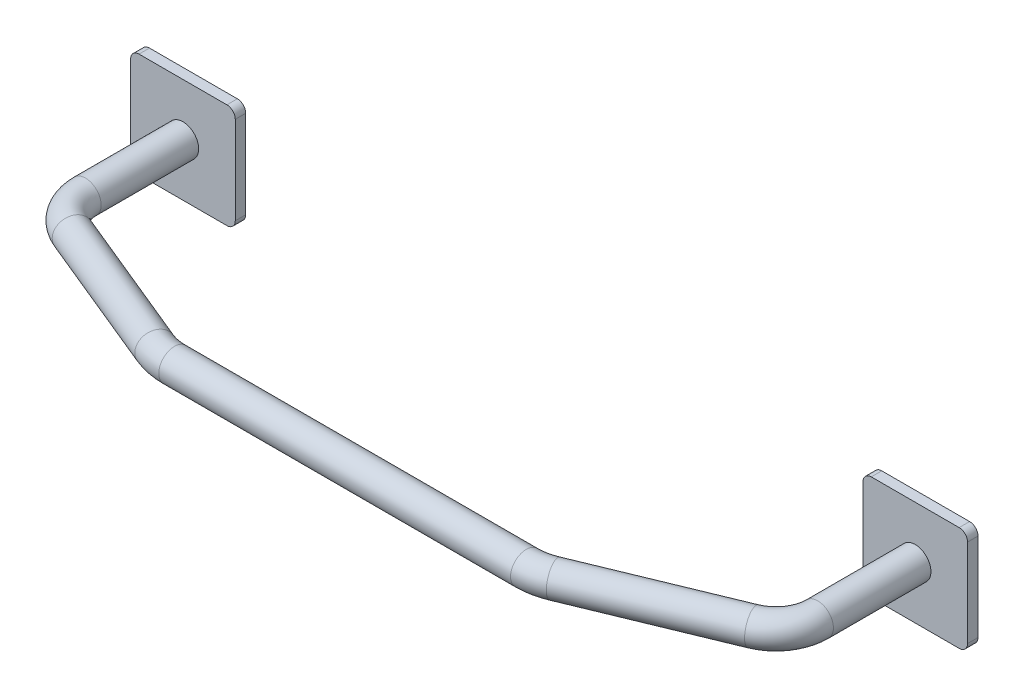
ISO-10303-21;
HEADER;
FILE_DESCRIPTION(('STEP AP214'),'2;1');
FILE_NAME('part.step','',(''),(''),'','','');
FILE_SCHEMA(('AUTOMOTIVE_DESIGN { 1 0 10303 214 1 1 1 1 }'));
ENDSEC;
DATA;
#1=APPLICATION_CONTEXT('core data for automotive mechanical design processes');
#2=APPLICATION_PROTOCOL_DEFINITION('international standard','automotive_design',2000,#1);
#3=PRODUCT_CONTEXT('',#1,'mechanical');
#4=PRODUCT('Part','Part','',(#3));
#5=PRODUCT_RELATED_PRODUCT_CATEGORY('part','',(#4));
#6=PRODUCT_DEFINITION_FORMATION('','',#4);
#7=PRODUCT_DEFINITION_CONTEXT('part definition',#1,'design');
#8=PRODUCT_DEFINITION('design','',#6,#7);
#9=PRODUCT_DEFINITION_SHAPE('','',#8);
#10=(LENGTH_UNIT() NAMED_UNIT(*) SI_UNIT(.MILLI.,.METRE.));
#11=(NAMED_UNIT(*) PLANE_ANGLE_UNIT() SI_UNIT($,.RADIAN.));
#12=(NAMED_UNIT(*) SI_UNIT($,.STERADIAN.) SOLID_ANGLE_UNIT());
#13=UNCERTAINTY_MEASURE_WITH_UNIT(LENGTH_MEASURE(1.E-05),#10,'distance_accuracy_value','');
#14=(GEOMETRIC_REPRESENTATION_CONTEXT(3) GLOBAL_UNCERTAINTY_ASSIGNED_CONTEXT((#13)) GLOBAL_UNIT_ASSIGNED_CONTEXT((#10,
#11,#12)) REPRESENTATION_CONTEXT('',''));
#15=CARTESIAN_POINT('',(0.,0.,0.));
#16=DIRECTION('',(0.,0.,1.));
#17=DIRECTION('',(1.,0.,0.));
#18=AXIS2_PLACEMENT_3D('',#15,#16,#17);
#19=CARTESIAN_POINT('',(-150.,25.,5.));
#20=DIRECTION('',(-1.,0.,0.));
#21=DIRECTION('',(0.,0.,1.));
#22=AXIS2_PLACEMENT_3D('',#19,#20,#21);
#23=PLANE('',#22);
#24=DIRECTION('',(0.,1.,0.));
#25=VECTOR('',#24,1.);
#26=CARTESIAN_POINT('',(-150.,25.,5.));
#27=LINE('',#26,#25);
#28=CARTESIAN_POINT('',(-150.,-21.,5.));
#29=VERTEX_POINT('',#28);
#30=CARTESIAN_POINT('',(-150.,21.,5.));
#31=VERTEX_POINT('',#30);
#32=EDGE_CURVE('E253',#29,#31,#27,.T.);
#33=ORIENTED_EDGE('',*,*,#32,.F.);
#34=DIRECTION('',(0.,0.,-1.));
#35=VECTOR('',#34,1.);
#36=CARTESIAN_POINT('',(-150.,-21.,5.));
#37=LINE('',#36,#35);
#38=CARTESIAN_POINT('',(-150.,-21.,0.));
#39=VERTEX_POINT('',#38);
#40=EDGE_CURVE('E279',#29,#39,#37,.T.);
#41=ORIENTED_EDGE('',*,*,#40,.T.);
#42=DIRECTION('',(0.,1.,0.));
#43=VECTOR('',#42,1.);
#44=CARTESIAN_POINT('',(-150.,25.,0.));
#45=LINE('',#44,#43);
#46=CARTESIAN_POINT('',(-150.,21.,0.));
#47=VERTEX_POINT('',#46);
#48=EDGE_CURVE('E251',#39,#47,#45,.T.);
#49=ORIENTED_EDGE('',*,*,#48,.T.);
#50=DIRECTION('',(0.,0.,-1.));
#51=VECTOR('',#50,1.);
#52=CARTESIAN_POINT('',(-150.,21.,5.));
#53=LINE('',#52,#51);
#54=EDGE_CURVE('E267',#47,#31,#53,.F.);
#55=ORIENTED_EDGE('',*,*,#54,.T.);
#56=EDGE_LOOP('',(#33,#41,#49,#55));
#57=FACE_BOUND('',#56,.T.);
#58=ADVANCED_FACE('F52',(#57),#23,.F.);
#59=CARTESIAN_POINT('',(-200.,25.,5.));
#60=DIRECTION('',(0.,-1.,0.));
#61=DIRECTION('',(0.,0.,-1.));
#62=AXIS2_PLACEMENT_3D('',#59,#60,#61);
#63=PLANE('',#62);
#64=DIRECTION('',(-1.,0.,0.));
#65=VECTOR('',#64,1.);
#66=CARTESIAN_POINT('',(-200.,25.,5.));
#67=LINE('',#66,#65);
#68=CARTESIAN_POINT('',(-154.,25.,5.));
#69=VERTEX_POINT('',#68);
#70=CARTESIAN_POINT('',(-196.,25.,5.));
#71=VERTEX_POINT('',#70);
#72=EDGE_CURVE('E257',#69,#71,#67,.T.);
#73=ORIENTED_EDGE('',*,*,#72,.F.);
#74=DIRECTION('',(0.,0.,-1.));
#75=VECTOR('',#74,1.);
#76=CARTESIAN_POINT('',(-154.,25.,5.));
#77=LINE('',#76,#75);
#78=CARTESIAN_POINT('',(-154.,25.,0.));
#79=VERTEX_POINT('',#78);
#80=EDGE_CURVE('E12',#69,#79,#77,.T.);
#81=ORIENTED_EDGE('',*,*,#80,.T.);
#82=DIRECTION('',(-1.,0.,0.));
#83=VECTOR('',#82,1.);
#84=CARTESIAN_POINT('',(-200.,25.,0.));
#85=LINE('',#84,#83);
#86=CARTESIAN_POINT('',(-196.,25.,0.));
#87=VERTEX_POINT('',#86);
#88=EDGE_CURVE('E269',#79,#87,#85,.T.);
#89=ORIENTED_EDGE('',*,*,#88,.T.);
#90=DIRECTION('',(0.,0.,-1.));
#91=VECTOR('',#90,1.);
#92=CARTESIAN_POINT('',(-196.,25.,5.));
#93=LINE('',#92,#91);
#94=EDGE_CURVE('E63',#87,#71,#93,.F.);
#95=ORIENTED_EDGE('',*,*,#94,.T.);
#96=EDGE_LOOP('',(#73,#81,#89,#95));
#97=FACE_BOUND('',#96,.T.);
#98=ADVANCED_FACE('F306',(#97),#63,.F.);
#99=CARTESIAN_POINT('',(-200.,25.,5.));
#100=DIRECTION('',(1.,0.,0.));
#101=DIRECTION('',(0.,0.,-1.));
#102=AXIS2_PLACEMENT_3D('',#99,#100,#101);
#103=PLANE('',#102);
#104=DIRECTION('',(0.,-1.,0.));
#105=VECTOR('',#104,1.);
#106=CARTESIAN_POINT('',(-200.,25.,0.));
#107=LINE('',#106,#105);
#108=CARTESIAN_POINT('',(-200.,21.,0.));
#109=VERTEX_POINT('',#108);
#110=CARTESIAN_POINT('',(-200.,-21.,0.));
#111=VERTEX_POINT('',#110);
#112=EDGE_CURVE('E275',#109,#111,#107,.T.);
#113=ORIENTED_EDGE('',*,*,#112,.T.);
#114=DIRECTION('',(0.,0.,-1.));
#115=VECTOR('',#114,1.);
#116=CARTESIAN_POINT('',(-200.,-21.,5.));
#117=LINE('',#116,#115);
#118=CARTESIAN_POINT('',(-200.,-21.,5.));
#119=VERTEX_POINT('',#118);
#120=EDGE_CURVE('E66',#111,#119,#117,.F.);
#121=ORIENTED_EDGE('',*,*,#120,.T.);
#122=DIRECTION('',(0.,-1.,0.));
#123=VECTOR('',#122,1.);
#124=CARTESIAN_POINT('',(-200.,25.,5.));
#125=LINE('',#124,#123);
#126=CARTESIAN_POINT('',(-200.,21.,5.));
#127=VERTEX_POINT('',#126);
#128=EDGE_CURVE('E263',#127,#119,#125,.T.);
#129=ORIENTED_EDGE('',*,*,#128,.F.);
#130=DIRECTION('',(0.,0.,-1.));
#131=VECTOR('',#130,1.);
#132=CARTESIAN_POINT('',(-200.,21.,5.));
#133=LINE('',#132,#131);
#134=EDGE_CURVE('E297',#127,#109,#133,.T.);
#135=ORIENTED_EDGE('',*,*,#134,.T.);
#136=EDGE_LOOP('',(#113,#121,#129,#135));
#137=FACE_BOUND('',#136,.T.);
#138=ADVANCED_FACE('F313',(#137),#103,.F.);
#139=CARTESIAN_POINT('',(-200.,-25.,5.));
#140=DIRECTION('',(0.,1.,0.));
#141=DIRECTION('',(0.,0.,1.));
#142=AXIS2_PLACEMENT_3D('',#139,#140,#141);
#143=PLANE('',#142);
#144=DIRECTION('',(1.,0.,0.));
#145=VECTOR('',#144,1.);
#146=CARTESIAN_POINT('',(-200.,-25.,0.));
#147=LINE('',#146,#145);
#148=CARTESIAN_POINT('',(-196.,-25.,0.));
#149=VERTEX_POINT('',#148);
#150=CARTESIAN_POINT('',(-154.,-25.,0.));
#151=VERTEX_POINT('',#150);
#152=EDGE_CURVE('E260',#149,#151,#147,.T.);
#153=ORIENTED_EDGE('',*,*,#152,.T.);
#154=DIRECTION('',(0.,0.,-1.));
#155=VECTOR('',#154,1.);
#156=CARTESIAN_POINT('',(-154.,-25.,5.));
#157=LINE('',#156,#155);
#158=CARTESIAN_POINT('',(-154.,-25.,5.));
#159=VERTEX_POINT('',#158);
#160=EDGE_CURVE('E293',#151,#159,#157,.F.);
#161=ORIENTED_EDGE('',*,*,#160,.T.);
#162=DIRECTION('',(1.,0.,0.));
#163=VECTOR('',#162,1.);
#164=CARTESIAN_POINT('',(-200.,-25.,5.));
#165=LINE('',#164,#163);
#166=CARTESIAN_POINT('',(-196.,-25.,5.));
#167=VERTEX_POINT('',#166);
#168=EDGE_CURVE('E261',#167,#159,#165,.T.);
#169=ORIENTED_EDGE('',*,*,#168,.F.);
#170=DIRECTION('',(0.,0.,-1.));
#171=VECTOR('',#170,1.);
#172=CARTESIAN_POINT('',(-196.,-25.,5.));
#173=LINE('',#172,#171);
#174=EDGE_CURVE('E288',#167,#149,#173,.T.);
#175=ORIENTED_EDGE('',*,*,#174,.T.);
#176=EDGE_LOOP('',(#153,#161,#169,#175));
#177=FACE_BOUND('',#176,.T.);
#178=ADVANCED_FACE('F321',(#177),#143,.F.);
#179=CARTESIAN_POINT('',(0.,0.,5.));
#180=DIRECTION('',(0.,0.,1.));
#181=DIRECTION('',(1.,0.,0.));
#182=AXIS2_PLACEMENT_3D('',#179,#180,#181);
#183=PLANE('',#182);
#184=CARTESIAN_POINT('',(-175.,0.,5.));
#185=DIRECTION('',(0.,0.,-1.));
#186=DIRECTION('',(-1.,0.,0.));
#187=AXIS2_PLACEMENT_3D('',#184,#185,#186);
#188=CIRCLE('',#187,7.50000000000001);
#189=CARTESIAN_POINT('',(-182.5,0.,5.));
#190=VERTEX_POINT('',#189);
#191=EDGE_CURVE('E237',#190,#190,#188,.T.);
#192=ORIENTED_EDGE('',*,*,#191,.T.);
#193=EDGE_LOOP('',(#192));
#194=FACE_BOUND('',#193,.T.);
#195=ORIENTED_EDGE('',*,*,#168,.T.);
#196=CARTESIAN_POINT('',(-154.,-21.,5.));
#197=DIRECTION('',(0.,0.,1.));
#198=DIRECTION('',(1.,0.,0.));
#199=AXIS2_PLACEMENT_3D('',#196,#197,#198);
#200=CIRCLE('',#199,4.);
#201=EDGE_CURVE('E296',#159,#29,#200,.T.);
#202=ORIENTED_EDGE('',*,*,#201,.T.);
#203=ORIENTED_EDGE('',*,*,#32,.T.);
#204=CARTESIAN_POINT('',(-154.,21.,5.));
#205=DIRECTION('',(0.,0.,1.));
#206=DIRECTION('',(1.,0.,0.));
#207=AXIS2_PLACEMENT_3D('',#204,#205,#206);
#208=CIRCLE('',#207,4.);
#209=EDGE_CURVE('E295',#31,#69,#208,.T.);
#210=ORIENTED_EDGE('',*,*,#209,.T.);
#211=ORIENTED_EDGE('',*,*,#72,.T.);
#212=CARTESIAN_POINT('',(-196.,21.,5.));
#213=DIRECTION('',(0.,0.,1.));
#214=DIRECTION('',(1.,0.,0.));
#215=AXIS2_PLACEMENT_3D('',#212,#213,#214);
#216=CIRCLE('',#215,4.);
#217=EDGE_CURVE('E71',#71,#127,#216,.T.);
#218=ORIENTED_EDGE('',*,*,#217,.T.);
#219=ORIENTED_EDGE('',*,*,#128,.T.);
#220=CARTESIAN_POINT('',(-196.,-21.,5.));
#221=DIRECTION('',(0.,0.,1.));
#222=DIRECTION('',(1.,0.,0.));
#223=AXIS2_PLACEMENT_3D('',#220,#221,#222);
#224=CIRCLE('',#223,4.);
#225=EDGE_CURVE('E298',#119,#167,#224,.T.);
#226=ORIENTED_EDGE('',*,*,#225,.T.);
#227=EDGE_LOOP('',(#195,#202,#203,#210,#211,#218,#219,#226));
#228=FACE_BOUND('',#227,.T.);
#229=ADVANCED_FACE('F309',(#194,#228),#183,.T.);
#230=CARTESIAN_POINT('',(0.,0.,0.));
#231=DIRECTION('',(0.,0.,1.));
#232=DIRECTION('',(1.,0.,0.));
#233=AXIS2_PLACEMENT_3D('',#230,#231,#232);
#234=PLANE('',#233);
#235=ORIENTED_EDGE('',*,*,#48,.F.);
#236=CARTESIAN_POINT('',(-154.,-21.,0.));
#237=DIRECTION('',(0.,0.,1.));
#238=DIRECTION('',(1.,0.,0.));
#239=AXIS2_PLACEMENT_3D('',#236,#237,#238);
#240=CIRCLE('',#239,4.);
#241=EDGE_CURVE('E287',#39,#151,#240,.F.);
#242=ORIENTED_EDGE('',*,*,#241,.T.);
#243=ORIENTED_EDGE('',*,*,#152,.F.);
#244=CARTESIAN_POINT('',(-196.,-21.,0.));
#245=DIRECTION('',(0.,0.,1.));
#246=DIRECTION('',(1.,0.,0.));
#247=AXIS2_PLACEMENT_3D('',#244,#245,#246);
#248=CIRCLE('',#247,4.);
#249=EDGE_CURVE('E282',#149,#111,#248,.F.);
#250=ORIENTED_EDGE('',*,*,#249,.T.);
#251=ORIENTED_EDGE('',*,*,#112,.F.);
#252=CARTESIAN_POINT('',(-196.,21.,0.));
#253=DIRECTION('',(0.,0.,1.));
#254=DIRECTION('',(1.,0.,0.));
#255=AXIS2_PLACEMENT_3D('',#252,#253,#254);
#256=CIRCLE('',#255,4.);
#257=EDGE_CURVE('E276',#109,#87,#256,.F.);
#258=ORIENTED_EDGE('',*,*,#257,.T.);
#259=ORIENTED_EDGE('',*,*,#88,.F.);
#260=CARTESIAN_POINT('',(-154.,21.,0.));
#261=DIRECTION('',(0.,0.,1.));
#262=DIRECTION('',(1.,0.,0.));
#263=AXIS2_PLACEMENT_3D('',#260,#261,#262);
#264=CIRCLE('',#263,4.);
#265=EDGE_CURVE('E285',#79,#47,#264,.F.);
#266=ORIENTED_EDGE('',*,*,#265,.T.);
#267=EDGE_LOOP('',(#235,#242,#243,#250,#251,#258,#259,#266));
#268=FACE_BOUND('',#267,.T.);
#269=ADVANCED_FACE('F320',(#268),#234,.F.);
#270=CARTESIAN_POINT('',(-175.,0.,5.));
#271=DIRECTION('',(0.,0.,1.));
#272=DIRECTION('',(1.,0.,0.));
#273=AXIS2_PLACEMENT_3D('',#270,#271,#272);
#274=CYLINDRICAL_SURFACE('',#273,7.50000000000001);
#275=CARTESIAN_POINT('',(-175.,0.,51.6061455166468));
#276=DIRECTION('',(0.,0.,-1.));
#277=DIRECTION('',(-1.,0.,0.));
#278=AXIS2_PLACEMENT_3D('',#275,#276,#277);
#279=CIRCLE('',#278,7.50000000000001);
#280=CARTESIAN_POINT('',(-182.5,0.,51.6061455166468));
#281=VERTEX_POINT('',#280);
#282=EDGE_CURVE('E245',#281,#281,#279,.T.);
#283=ORIENTED_EDGE('',*,*,#282,.T.);
#284=EDGE_LOOP('',(#283));
#285=FACE_BOUND('',#284,.T.);
#286=ORIENTED_EDGE('',*,*,#191,.F.);
#287=EDGE_LOOP('',(#286));
#288=FACE_BOUND('',#287,.T.);
#289=ADVANCED_FACE('F353',(#285,#288),#274,.T.);
#290=CARTESIAN_POINT('',(-155.,0.,51.6061455166468));
#291=DIRECTION('',(0.,1.,0.));
#292=DIRECTION('',(0.,0.,1.));
#293=AXIS2_PLACEMENT_3D('',#290,#291,#292);
#294=TOROIDAL_SURFACE('',#293,20.,7.50000000000001);
#295=CARTESIAN_POINT('',(-162.614996105086,0.,70.0997074861411));
#296=DIRECTION('',(-0.924678098474716,0.,-0.380749805254295));
#297=DIRECTION('',(-0.380749805254295,0.,0.924678098474716));
#298=AXIS2_PLACEMENT_3D('',#295,#296,#297);
#299=CIRCLE('',#298,7.50000000000001);
#300=CARTESIAN_POINT('',(-165.470619644493,0.,77.0347932247015));
#301=VERTEX_POINT('',#300);
#302=EDGE_CURVE('E244',#301,#301,#299,.T.);
#303=CARTESIAN_POINT('',(-155.,0.,51.6061455166468));
#304=DIRECTION('',(0.,1.,0.));
#305=DIRECTION('',(0.,0.,1.));
#306=AXIS2_PLACEMENT_3D('',#303,#304,#305);
#307=CIRCLE('',#306,27.5);
#308=EDGE_CURVE('',#281,#301,#307,.T.);
#309=ORIENTED_EDGE('',*,*,#282,.F.);
#310=ORIENTED_EDGE('',*,*,#302,.T.);
#311=ORIENTED_EDGE('',*,*,#308,.T.);
#312=ORIENTED_EDGE('',*,*,#308,.F.);
#313=EDGE_LOOP('',(#309,#311,#310,#312));
#314=FACE_BOUND('',#313,.T.);
#315=ADVANCED_FACE('F363',(#314),#294,.T.);
#316=CARTESIAN_POINT('',(-162.614996105086,0.,70.0997074861411));
#317=DIRECTION('',(0.924678098474716,0.,0.380749805254295));
#318=DIRECTION('',(0.380749805254295,0.,-0.924678098474716));
#319=AXIS2_PLACEMENT_3D('',#316,#317,#318);
#320=CYLINDRICAL_SURFACE('',#319,7.50000000000001);
#321=CARTESIAN_POINT('',(-95.4877385396994,0.,97.7403429542414));
#322=DIRECTION('',(-0.924678098474716,0.,-0.380749805254295));
#323=DIRECTION('',(-0.380749805254295,0.,0.924678098474716));
#324=AXIS2_PLACEMENT_3D('',#321,#322,#323);
#325=CIRCLE('',#324,7.50000000000001);
#326=CARTESIAN_POINT('',(-98.3433620791066,0.,104.675428692802));
#327=VERTEX_POINT('',#326);
#328=EDGE_CURVE('E247',#327,#327,#325,.T.);
#329=ORIENTED_EDGE('',*,*,#328,.T.);
#330=EDGE_LOOP('',(#329));
#331=FACE_BOUND('',#330,.T.);
#332=ORIENTED_EDGE('',*,*,#302,.F.);
#333=EDGE_LOOP('',(#332));
#334=FACE_BOUND('',#333,.T.);
#335=ADVANCED_FACE('F366',(#331,#334),#320,.T.);
#336=CARTESIAN_POINT('',(-84.0652443820704,0.,70.));
#337=DIRECTION('',(0.,1.,0.));
#338=DIRECTION('',(0.,0.,1.));
#339=AXIS2_PLACEMENT_3D('',#336,#337,#338);
#340=TOROIDAL_SURFACE('',#339,30.,7.50000000000001);
#341=CARTESIAN_POINT('',(-84.0652443820704,0.,100.));
#342=DIRECTION('',(-1.,0.,0.));
#343=DIRECTION('',(0.,0.,1.));
#344=AXIS2_PLACEMENT_3D('',#341,#342,#343);
#345=CIRCLE('',#344,7.50000000000001);
#346=CARTESIAN_POINT('',(-84.0652443820704,0.,107.5));
#347=VERTEX_POINT('',#346);
#348=EDGE_CURVE('E252',#347,#347,#345,.T.);
#349=CARTESIAN_POINT('',(-84.0652443820704,0.,70.));
#350=DIRECTION('',(0.,1.,0.));
#351=DIRECTION('',(0.,0.,1.));
#352=AXIS2_PLACEMENT_3D('',#349,#350,#351);
#353=CIRCLE('',#352,37.5);
#354=EDGE_CURVE('',#327,#347,#353,.T.);
#355=ORIENTED_EDGE('',*,*,#328,.F.);
#356=ORIENTED_EDGE('',*,*,#348,.T.);
#357=ORIENTED_EDGE('',*,*,#354,.T.);
#358=ORIENTED_EDGE('',*,*,#354,.F.);
#359=EDGE_LOOP('',(#355,#357,#356,#358));
#360=FACE_BOUND('',#359,.T.);
#361=ADVANCED_FACE('F357',(#360),#340,.T.);
#362=CARTESIAN_POINT('',(-84.0652443820704,0.,100.));
#363=DIRECTION('',(1.,0.,0.));
#364=DIRECTION('',(0.,0.,-1.));
#365=AXIS2_PLACEMENT_3D('',#362,#363,#364);
#366=CYLINDRICAL_SURFACE('',#365,7.50000000000001);
#367=ORIENTED_EDGE('',*,*,#348,.F.);
#368=EDGE_LOOP('',(#367));
#369=FACE_BOUND('',#368,.T.);
#370=CARTESIAN_POINT('',(84.0652443820704,0.,100.));
#371=DIRECTION('',(-1.,0.,0.));
#372=DIRECTION('',(0.,0.,1.));
#373=AXIS2_PLACEMENT_3D('',#370,#371,#372);
#374=CIRCLE('',#373,7.50000000000001);
#375=CARTESIAN_POINT('',(84.0652443820704,0.,107.5));
#376=VERTEX_POINT('',#375);
#377=EDGE_CURVE('E191',#376,#376,#374,.T.);
#378=ORIENTED_EDGE('',*,*,#377,.T.);
#379=EDGE_LOOP('',(#378));
#380=FACE_BOUND('',#379,.T.);
#381=ADVANCED_FACE('F355',(#369,#380),#366,.T.);
#382=CARTESIAN_POINT('',(-154.,-21.,5.));
#383=DIRECTION('',(0.,0.,-1.));
#384=DIRECTION('',(-1.,0.,0.));
#385=AXIS2_PLACEMENT_3D('',#382,#383,#384);
#386=CYLINDRICAL_SURFACE('',#385,4.);
#387=ORIENTED_EDGE('',*,*,#201,.F.);
#388=ORIENTED_EDGE('',*,*,#160,.F.);
#389=ORIENTED_EDGE('',*,*,#241,.F.);
#390=ORIENTED_EDGE('',*,*,#40,.F.);
#391=EDGE_LOOP('',(#387,#388,#389,#390));
#392=FACE_BOUND('',#391,.T.);
#393=ADVANCED_FACE('F332',(#392),#386,.T.);
#394=CARTESIAN_POINT('',(-196.,-21.,5.));
#395=DIRECTION('',(0.,0.,-1.));
#396=DIRECTION('',(-1.,0.,0.));
#397=AXIS2_PLACEMENT_3D('',#394,#395,#396);
#398=CYLINDRICAL_SURFACE('',#397,4.);
#399=ORIENTED_EDGE('',*,*,#225,.F.);
#400=ORIENTED_EDGE('',*,*,#120,.F.);
#401=ORIENTED_EDGE('',*,*,#249,.F.);
#402=ORIENTED_EDGE('',*,*,#174,.F.);
#403=EDGE_LOOP('',(#399,#400,#401,#402));
#404=FACE_BOUND('',#403,.T.);
#405=ADVANCED_FACE('F324',(#404),#398,.T.);
#406=CARTESIAN_POINT('',(-154.,21.,5.));
#407=DIRECTION('',(0.,0.,-1.));
#408=DIRECTION('',(-1.,0.,0.));
#409=AXIS2_PLACEMENT_3D('',#406,#407,#408);
#410=CYLINDRICAL_SURFACE('',#409,4.);
#411=ORIENTED_EDGE('',*,*,#209,.F.);
#412=ORIENTED_EDGE('',*,*,#54,.F.);
#413=ORIENTED_EDGE('',*,*,#265,.F.);
#414=ORIENTED_EDGE('',*,*,#80,.F.);
#415=EDGE_LOOP('',(#411,#412,#413,#414));
#416=FACE_BOUND('',#415,.T.);
#417=ADVANCED_FACE('F331',(#416),#410,.T.);
#418=CARTESIAN_POINT('',(-196.,21.,5.));
#419=DIRECTION('',(0.,0.,-1.));
#420=DIRECTION('',(-1.,0.,0.));
#421=AXIS2_PLACEMENT_3D('',#418,#419,#420);
#422=CYLINDRICAL_SURFACE('',#421,4.);
#423=ORIENTED_EDGE('',*,*,#217,.F.);
#424=ORIENTED_EDGE('',*,*,#94,.F.);
#425=ORIENTED_EDGE('',*,*,#257,.F.);
#426=ORIENTED_EDGE('',*,*,#134,.F.);
#427=EDGE_LOOP('',(#423,#424,#425,#426));
#428=FACE_BOUND('',#427,.T.);
#429=ADVANCED_FACE('F54',(#428),#422,.T.);
#430=CARTESIAN_POINT('',(150.,25.,5.));
#431=DIRECTION('',(1.,0.,0.));
#432=DIRECTION('',(0.,0.,1.));
#433=AXIS2_PLACEMENT_3D('',#430,#431,#432);
#434=PLANE('',#433);
#435=DIRECTION('',(0.,1.,0.));
#436=VECTOR('',#435,1.);
#437=CARTESIAN_POINT('',(150.,25.,5.));
#438=LINE('',#437,#436);
#439=CARTESIAN_POINT('',(150.,-21.,5.));
#440=VERTEX_POINT('',#439);
#441=CARTESIAN_POINT('',(150.,21.,5.));
#442=VERTEX_POINT('',#441);
#443=EDGE_CURVE('E208',#440,#442,#438,.T.);
#444=ORIENTED_EDGE('',*,*,#443,.T.);
#445=DIRECTION('',(0.,0.,-1.));
#446=VECTOR('',#445,1.);
#447=CARTESIAN_POINT('',(150.,21.,5.));
#448=LINE('',#447,#446);
#449=CARTESIAN_POINT('',(150.,21.,0.));
#450=VERTEX_POINT('',#449);
#451=EDGE_CURVE('E188',#450,#442,#448,.F.);
#452=ORIENTED_EDGE('',*,*,#451,.F.);
#453=DIRECTION('',(0.,1.,0.));
#454=VECTOR('',#453,1.);
#455=CARTESIAN_POINT('',(150.,25.,0.));
#456=LINE('',#455,#454);
#457=CARTESIAN_POINT('',(150.,-21.,0.));
#458=VERTEX_POINT('',#457);
#459=EDGE_CURVE('E175',#458,#450,#456,.T.);
#460=ORIENTED_EDGE('',*,*,#459,.F.);
#461=DIRECTION('',(0.,0.,-1.));
#462=VECTOR('',#461,1.);
#463=CARTESIAN_POINT('',(150.,-21.,5.));
#464=LINE('',#463,#462);
#465=EDGE_CURVE('E182',#440,#458,#464,.T.);
#466=ORIENTED_EDGE('',*,*,#465,.F.);
#467=EDGE_LOOP('',(#444,#452,#460,#466));
#468=FACE_BOUND('',#467,.T.);
#469=ADVANCED_FACE('F194',(#468),#434,.F.);
#470=CARTESIAN_POINT('',(200.,25.,5.));
#471=DIRECTION('',(0.,-1.,0.));
#472=DIRECTION('',(0.,0.,-1.));
#473=AXIS2_PLACEMENT_3D('',#470,#471,#472);
#474=PLANE('',#473);
#475=DIRECTION('',(1.,0.,0.));
#476=VECTOR('',#475,1.);
#477=CARTESIAN_POINT('',(200.,25.,5.));
#478=LINE('',#477,#476);
#479=CARTESIAN_POINT('',(154.,25.,5.));
#480=VERTEX_POINT('',#479);
#481=CARTESIAN_POINT('',(196.,25.,5.));
#482=VERTEX_POINT('',#481);
#483=EDGE_CURVE('E614',#480,#482,#478,.T.);
#484=ORIENTED_EDGE('',*,*,#483,.T.);
#485=DIRECTION('',(0.,0.,-1.));
#486=VECTOR('',#485,1.);
#487=CARTESIAN_POINT('',(196.,25.,5.));
#488=LINE('',#487,#486);
#489=CARTESIAN_POINT('',(196.,25.,0.));
#490=VERTEX_POINT('',#489);
#491=EDGE_CURVE('E231',#490,#482,#488,.F.);
#492=ORIENTED_EDGE('',*,*,#491,.F.);
#493=DIRECTION('',(1.,0.,0.));
#494=VECTOR('',#493,1.);
#495=CARTESIAN_POINT('',(200.,25.,0.));
#496=LINE('',#495,#494);
#497=CARTESIAN_POINT('',(154.,25.,0.));
#498=VERTEX_POINT('',#497);
#499=EDGE_CURVE('E195',#498,#490,#496,.T.);
#500=ORIENTED_EDGE('',*,*,#499,.F.);
#501=DIRECTION('',(0.,0.,-1.));
#502=VECTOR('',#501,1.);
#503=CARTESIAN_POINT('',(154.,25.,5.));
#504=LINE('',#503,#502);
#505=EDGE_CURVE('E236',#480,#498,#504,.T.);
#506=ORIENTED_EDGE('',*,*,#505,.F.);
#507=EDGE_LOOP('',(#484,#492,#500,#506));
#508=FACE_BOUND('',#507,.T.);
#509=ADVANCED_FACE('F420',(#508),#474,.F.);
#510=CARTESIAN_POINT('',(200.,25.,5.));
#511=DIRECTION('',(-1.,0.,0.));
#512=DIRECTION('',(0.,0.,-1.));
#513=AXIS2_PLACEMENT_3D('',#510,#511,#512);
#514=PLANE('',#513);
#515=DIRECTION('',(0.,-1.,0.));
#516=VECTOR('',#515,1.);
#517=CARTESIAN_POINT('',(200.,25.,0.));
#518=LINE('',#517,#516);
#519=CARTESIAN_POINT('',(200.,21.,0.));
#520=VERTEX_POINT('',#519);
#521=CARTESIAN_POINT('',(200.,-21.,0.));
#522=VERTEX_POINT('',#521);
#523=EDGE_CURVE('E196',#520,#522,#518,.T.);
#524=ORIENTED_EDGE('',*,*,#523,.F.);
#525=DIRECTION('',(0.,0.,-1.));
#526=VECTOR('',#525,1.);
#527=CARTESIAN_POINT('',(200.,21.,5.));
#528=LINE('',#527,#526);
#529=CARTESIAN_POINT('',(200.,21.,5.));
#530=VERTEX_POINT('',#529);
#531=EDGE_CURVE('E227',#530,#520,#528,.T.);
#532=ORIENTED_EDGE('',*,*,#531,.F.);
#533=DIRECTION('',(0.,-1.,0.));
#534=VECTOR('',#533,1.);
#535=CARTESIAN_POINT('',(200.,25.,5.));
#536=LINE('',#535,#534);
#537=CARTESIAN_POINT('',(200.,-21.,5.));
#538=VERTEX_POINT('',#537);
#539=EDGE_CURVE('E612',#530,#538,#536,.T.);
#540=ORIENTED_EDGE('',*,*,#539,.T.);
#541=DIRECTION('',(0.,0.,-1.));
#542=VECTOR('',#541,1.);
#543=CARTESIAN_POINT('',(200.,-21.,5.));
#544=LINE('',#543,#542);
#545=EDGE_CURVE('E229',#522,#538,#544,.F.);
#546=ORIENTED_EDGE('',*,*,#545,.F.);
#547=EDGE_LOOP('',(#524,#532,#540,#546));
#548=FACE_BOUND('',#547,.T.);
#549=ADVANCED_FACE('F424',(#548),#514,.F.);
#550=CARTESIAN_POINT('',(200.,-25.,5.));
#551=DIRECTION('',(0.,1.,0.));
#552=DIRECTION('',(0.,0.,1.));
#553=AXIS2_PLACEMENT_3D('',#550,#551,#552);
#554=PLANE('',#553);
#555=DIRECTION('',(-1.,0.,0.));
#556=VECTOR('',#555,1.);
#557=CARTESIAN_POINT('',(200.,-25.,0.));
#558=LINE('',#557,#556);
#559=CARTESIAN_POINT('',(196.,-25.,0.));
#560=VERTEX_POINT('',#559);
#561=CARTESIAN_POINT('',(154.,-25.,0.));
#562=VERTEX_POINT('',#561);
#563=EDGE_CURVE('E174',#560,#562,#558,.T.);
#564=ORIENTED_EDGE('',*,*,#563,.F.);
#565=DIRECTION('',(0.,0.,-1.));
#566=VECTOR('',#565,1.);
#567=CARTESIAN_POINT('',(196.,-25.,5.));
#568=LINE('',#567,#566);
#569=CARTESIAN_POINT('',(196.,-25.,5.));
#570=VERTEX_POINT('',#569);
#571=EDGE_CURVE('E177',#570,#560,#568,.T.);
#572=ORIENTED_EDGE('',*,*,#571,.F.);
#573=DIRECTION('',(-1.,0.,0.));
#574=VECTOR('',#573,1.);
#575=CARTESIAN_POINT('',(200.,-25.,5.));
#576=LINE('',#575,#574);
#577=CARTESIAN_POINT('',(154.,-25.,5.));
#578=VERTEX_POINT('',#577);
#579=EDGE_CURVE('E204',#570,#578,#576,.T.);
#580=ORIENTED_EDGE('',*,*,#579,.T.);
#581=DIRECTION('',(0.,0.,-1.));
#582=VECTOR('',#581,1.);
#583=CARTESIAN_POINT('',(154.,-25.,5.));
#584=LINE('',#583,#582);
#585=EDGE_CURVE('E216',#562,#578,#584,.F.);
#586=ORIENTED_EDGE('',*,*,#585,.F.);
#587=EDGE_LOOP('',(#564,#572,#580,#586));
#588=FACE_BOUND('',#587,.T.);
#589=ADVANCED_FACE('F432',(#588),#554,.F.);
#590=CARTESIAN_POINT('',(0.,0.,5.));
#591=DIRECTION('',(0.,0.,1.));
#592=DIRECTION('',(-1.,0.,0.));
#593=AXIS2_PLACEMENT_3D('',#590,#591,#592);
#594=PLANE('',#593);
#595=CARTESIAN_POINT('',(175.,0.,5.));
#596=DIRECTION('',(0.,0.,1.));
#597=DIRECTION('',(1.,0.,0.));
#598=AXIS2_PLACEMENT_3D('',#595,#596,#597);
#599=CIRCLE('',#598,7.50000000000001);
#600=CARTESIAN_POINT('',(182.5,0.,5.));
#601=VERTEX_POINT('',#600);
#602=EDGE_CURVE('E628',#601,#601,#599,.T.);
#603=ORIENTED_EDGE('',*,*,#602,.F.);
#604=EDGE_LOOP('',(#603));
#605=FACE_BOUND('',#604,.T.);
#606=ORIENTED_EDGE('',*,*,#579,.F.);
#607=CARTESIAN_POINT('',(196.,-21.,5.));
#608=DIRECTION('',(0.,0.,-1.));
#609=DIRECTION('',(-1.,0.,0.));
#610=AXIS2_PLACEMENT_3D('',#607,#608,#609);
#611=CIRCLE('',#610,4.);
#612=EDGE_CURVE('E224',#538,#570,#611,.T.);
#613=ORIENTED_EDGE('',*,*,#612,.F.);
#614=ORIENTED_EDGE('',*,*,#539,.F.);
#615=CARTESIAN_POINT('',(196.,21.,5.));
#616=DIRECTION('',(0.,0.,-1.));
#617=DIRECTION('',(-1.,0.,0.));
#618=AXIS2_PLACEMENT_3D('',#615,#616,#617);
#619=CIRCLE('',#618,4.);
#620=EDGE_CURVE('E219',#482,#530,#619,.T.);
#621=ORIENTED_EDGE('',*,*,#620,.F.);
#622=ORIENTED_EDGE('',*,*,#483,.F.);
#623=CARTESIAN_POINT('',(154.,21.,5.));
#624=DIRECTION('',(0.,0.,-1.));
#625=DIRECTION('',(-1.,0.,0.));
#626=AXIS2_PLACEMENT_3D('',#623,#624,#625);
#627=CIRCLE('',#626,4.);
#628=EDGE_CURVE('E225',#442,#480,#627,.T.);
#629=ORIENTED_EDGE('',*,*,#628,.F.);
#630=ORIENTED_EDGE('',*,*,#443,.F.);
#631=CARTESIAN_POINT('',(154.,-21.,5.));
#632=DIRECTION('',(0.,0.,-1.));
#633=DIRECTION('',(-1.,0.,0.));
#634=AXIS2_PLACEMENT_3D('',#631,#632,#633);
#635=CIRCLE('',#634,4.);
#636=EDGE_CURVE('E184',#578,#440,#635,.T.);
#637=ORIENTED_EDGE('',*,*,#636,.F.);
#638=EDGE_LOOP('',(#606,#613,#614,#621,#622,#629,#630,#637));
#639=FACE_BOUND('',#638,.T.);
#640=ADVANCED_FACE('F442',(#605,#639),#594,.T.);
#641=CARTESIAN_POINT('',(0.,0.,0.));
#642=DIRECTION('',(0.,0.,1.));
#643=DIRECTION('',(-1.,0.,0.));
#644=AXIS2_PLACEMENT_3D('',#641,#642,#643);
#645=PLANE('',#644);
#646=ORIENTED_EDGE('',*,*,#459,.T.);
#647=CARTESIAN_POINT('',(154.,21.,0.));
#648=DIRECTION('',(0.,0.,-1.));
#649=DIRECTION('',(-1.,0.,0.));
#650=AXIS2_PLACEMENT_3D('',#647,#648,#649);
#651=CIRCLE('',#650,4.);
#652=EDGE_CURVE('E212',#498,#450,#651,.F.);
#653=ORIENTED_EDGE('',*,*,#652,.F.);
#654=ORIENTED_EDGE('',*,*,#499,.T.);
#655=CARTESIAN_POINT('',(196.,21.,0.));
#656=DIRECTION('',(0.,0.,-1.));
#657=DIRECTION('',(-1.,0.,0.));
#658=AXIS2_PLACEMENT_3D('',#655,#656,#657);
#659=CIRCLE('',#658,4.);
#660=EDGE_CURVE('E186',#520,#490,#659,.F.);
#661=ORIENTED_EDGE('',*,*,#660,.F.);
#662=ORIENTED_EDGE('',*,*,#523,.T.);
#663=CARTESIAN_POINT('',(196.,-21.,0.));
#664=DIRECTION('',(0.,0.,-1.));
#665=DIRECTION('',(-1.,0.,0.));
#666=AXIS2_PLACEMENT_3D('',#663,#664,#665);
#667=CIRCLE('',#666,4.);
#668=EDGE_CURVE('E179',#560,#522,#667,.F.);
#669=ORIENTED_EDGE('',*,*,#668,.F.);
#670=ORIENTED_EDGE('',*,*,#563,.T.);
#671=CARTESIAN_POINT('',(154.,-21.,0.));
#672=DIRECTION('',(0.,0.,-1.));
#673=DIRECTION('',(-1.,0.,0.));
#674=AXIS2_PLACEMENT_3D('',#671,#672,#673);
#675=CIRCLE('',#674,4.);
#676=EDGE_CURVE('E166',#458,#562,#675,.F.);
#677=ORIENTED_EDGE('',*,*,#676,.F.);
#678=EDGE_LOOP('',(#646,#653,#654,#661,#662,#669,#670,#677));
#679=FACE_BOUND('',#678,.T.);
#680=ADVANCED_FACE('F167',(#679),#645,.F.);
#681=CARTESIAN_POINT('',(175.,0.,5.));
#682=DIRECTION('',(0.,0.,1.));
#683=DIRECTION('',(-1.,0.,0.));
#684=AXIS2_PLACEMENT_3D('',#681,#682,#683);
#685=CYLINDRICAL_SURFACE('',#684,7.50000000000001);
#686=CARTESIAN_POINT('',(175.,0.,51.6061455166468));
#687=DIRECTION('',(0.,0.,1.));
#688=DIRECTION('',(1.,0.,0.));
#689=AXIS2_PLACEMENT_3D('',#686,#687,#688);
#690=CIRCLE('',#689,7.50000000000001);
#691=CARTESIAN_POINT('',(182.5,0.,51.6061455166468));
#692=VERTEX_POINT('',#691);
#693=EDGE_CURVE('E622',#692,#692,#690,.T.);
#694=ORIENTED_EDGE('',*,*,#693,.F.);
#695=EDGE_LOOP('',(#694));
#696=FACE_BOUND('',#695,.T.);
#697=ORIENTED_EDGE('',*,*,#602,.T.);
#698=EDGE_LOOP('',(#697));
#699=FACE_BOUND('',#698,.T.);
#700=ADVANCED_FACE('F459',(#696,#699),#685,.T.);
#701=CARTESIAN_POINT('',(155.,0.,51.6061455166468));
#702=DIRECTION('',(0.,1.,0.));
#703=DIRECTION('',(0.,0.,1.));
#704=AXIS2_PLACEMENT_3D('',#701,#702,#703);
#705=TOROIDAL_SURFACE('',#704,20.,7.50000000000001);
#706=CARTESIAN_POINT('',(162.614996105086,0.,70.0997074861411));
#707=DIRECTION('',(-0.924678098474716,0.,0.380749805254295));
#708=DIRECTION('',(0.380749805254295,0.,0.924678098474716));
#709=AXIS2_PLACEMENT_3D('',#706,#707,#708);
#710=CIRCLE('',#709,7.50000000000001);
#711=CARTESIAN_POINT('',(165.470619644493,0.,77.0347932247015));
#712=VERTEX_POINT('',#711);
#713=EDGE_CURVE('E625',#712,#712,#710,.T.);
#714=CARTESIAN_POINT('',(155.,0.,51.6061455166468));
#715=DIRECTION('',(0.,1.,0.));
#716=DIRECTION('',(0.,0.,1.));
#717=AXIS2_PLACEMENT_3D('',#714,#715,#716);
#718=CIRCLE('',#717,27.5);
#719=EDGE_CURVE('',#712,#692,#718,.T.);
#720=ORIENTED_EDGE('',*,*,#713,.F.);
#721=ORIENTED_EDGE('',*,*,#693,.T.);
#722=ORIENTED_EDGE('',*,*,#719,.T.);
#723=ORIENTED_EDGE('',*,*,#719,.F.);
#724=EDGE_LOOP('',(#720,#722,#721,#723));
#725=FACE_BOUND('',#724,.T.);
#726=ADVANCED_FACE('F466',(#725),#705,.T.);
#727=CARTESIAN_POINT('',(162.614996105086,0.,70.0997074861411));
#728=DIRECTION('',(-0.924678098474716,0.,0.380749805254295));
#729=DIRECTION('',(-0.380749805254295,0.,-0.924678098474716));
#730=AXIS2_PLACEMENT_3D('',#727,#728,#729);
#731=CYLINDRICAL_SURFACE('',#730,7.50000000000001);
#732=CARTESIAN_POINT('',(95.4877385396994,0.,97.7403429542414));
#733=DIRECTION('',(-0.924678098474716,0.,0.380749805254295));
#734=DIRECTION('',(0.380749805254295,0.,0.924678098474716));
#735=AXIS2_PLACEMENT_3D('',#732,#733,#734);
#736=CIRCLE('',#735,7.50000000000001);
#737=CARTESIAN_POINT('',(98.3433620791066,0.,104.675428692802));
#738=VERTEX_POINT('',#737);
#739=EDGE_CURVE('E202',#738,#738,#736,.T.);
#740=ORIENTED_EDGE('',*,*,#739,.F.);
#741=EDGE_LOOP('',(#740));
#742=FACE_BOUND('',#741,.T.);
#743=ORIENTED_EDGE('',*,*,#713,.T.);
#744=EDGE_LOOP('',(#743));
#745=FACE_BOUND('',#744,.T.);
#746=ADVANCED_FACE('F480',(#742,#745),#731,.T.);
#747=CARTESIAN_POINT('',(84.0652443820704,0.,70.));
#748=DIRECTION('',(0.,1.,0.));
#749=DIRECTION('',(0.,0.,1.));
#750=AXIS2_PLACEMENT_3D('',#747,#748,#749);
#751=TOROIDAL_SURFACE('',#750,30.,7.50000000000001);
#752=CARTESIAN_POINT('',(84.0652443820704,0.,70.));
#753=DIRECTION('',(0.,1.,0.));
#754=DIRECTION('',(0.,0.,1.));
#755=AXIS2_PLACEMENT_3D('',#752,#753,#754);
#756=CIRCLE('',#755,37.5);
#757=EDGE_CURVE('',#376,#738,#756,.T.);
#758=ORIENTED_EDGE('',*,*,#377,.F.);
#759=ORIENTED_EDGE('',*,*,#739,.T.);
#760=ORIENTED_EDGE('',*,*,#757,.T.);
#761=ORIENTED_EDGE('',*,*,#757,.F.);
#762=EDGE_LOOP('',(#758,#760,#759,#761));
#763=FACE_BOUND('',#762,.T.);
#764=ADVANCED_FACE('F488',(#763),#751,.T.);
#765=CARTESIAN_POINT('',(154.,-21.,5.));
#766=DIRECTION('',(0.,0.,-1.));
#767=DIRECTION('',(1.,0.,0.));
#768=AXIS2_PLACEMENT_3D('',#765,#766,#767);
#769=CYLINDRICAL_SURFACE('',#768,4.);
#770=ORIENTED_EDGE('',*,*,#636,.T.);
#771=ORIENTED_EDGE('',*,*,#465,.T.);
#772=ORIENTED_EDGE('',*,*,#676,.T.);
#773=ORIENTED_EDGE('',*,*,#585,.T.);
#774=EDGE_LOOP('',(#770,#771,#772,#773));
#775=FACE_BOUND('',#774,.T.);
#776=ADVANCED_FACE('F183',(#775),#769,.T.);
#777=CARTESIAN_POINT('',(196.,-21.,5.));
#778=DIRECTION('',(0.,0.,-1.));
#779=DIRECTION('',(1.,0.,0.));
#780=AXIS2_PLACEMENT_3D('',#777,#778,#779);
#781=CYLINDRICAL_SURFACE('',#780,4.);
#782=ORIENTED_EDGE('',*,*,#612,.T.);
#783=ORIENTED_EDGE('',*,*,#571,.T.);
#784=ORIENTED_EDGE('',*,*,#668,.T.);
#785=ORIENTED_EDGE('',*,*,#545,.T.);
#786=EDGE_LOOP('',(#782,#783,#784,#785));
#787=FACE_BOUND('',#786,.T.);
#788=ADVANCED_FACE('F503',(#787),#781,.T.);
#789=CARTESIAN_POINT('',(154.,21.,5.));
#790=DIRECTION('',(0.,0.,-1.));
#791=DIRECTION('',(1.,0.,0.));
#792=AXIS2_PLACEMENT_3D('',#789,#790,#791);
#793=CYLINDRICAL_SURFACE('',#792,4.);
#794=ORIENTED_EDGE('',*,*,#628,.T.);
#795=ORIENTED_EDGE('',*,*,#505,.T.);
#796=ORIENTED_EDGE('',*,*,#652,.T.);
#797=ORIENTED_EDGE('',*,*,#451,.T.);
#798=EDGE_LOOP('',(#794,#795,#796,#797));
#799=FACE_BOUND('',#798,.T.);
#800=ADVANCED_FACE('F512',(#799),#793,.T.);
#801=CARTESIAN_POINT('',(196.,21.,5.));
#802=DIRECTION('',(0.,0.,-1.));
#803=DIRECTION('',(1.,0.,0.));
#804=AXIS2_PLACEMENT_3D('',#801,#802,#803);
#805=CYLINDRICAL_SURFACE('',#804,4.);
#806=ORIENTED_EDGE('',*,*,#620,.T.);
#807=ORIENTED_EDGE('',*,*,#531,.T.);
#808=ORIENTED_EDGE('',*,*,#660,.T.);
#809=ORIENTED_EDGE('',*,*,#491,.T.);
#810=EDGE_LOOP('',(#806,#807,#808,#809));
#811=FACE_BOUND('',#810,.T.);
#812=ADVANCED_FACE('F373',(#811),#805,.T.);
#813=CLOSED_SHELL('',(#58,#98,#138,#178,#229,#269,#289,#315,#335,#361,#381,#393,#405,#417,#429,
#469,#509,#549,#589,#640,#680,#700,#726,#746,#764,#776,#788,#800,#812));
#814=MANIFOLD_SOLID_BREP('B2',#813);
#815=ADVANCED_BREP_SHAPE_REPRESENTATION('',(#18,#814),#14);
#816=SHAPE_DEFINITION_REPRESENTATION(#9,#815);
ENDSEC;
END-ISO-10303-21;
